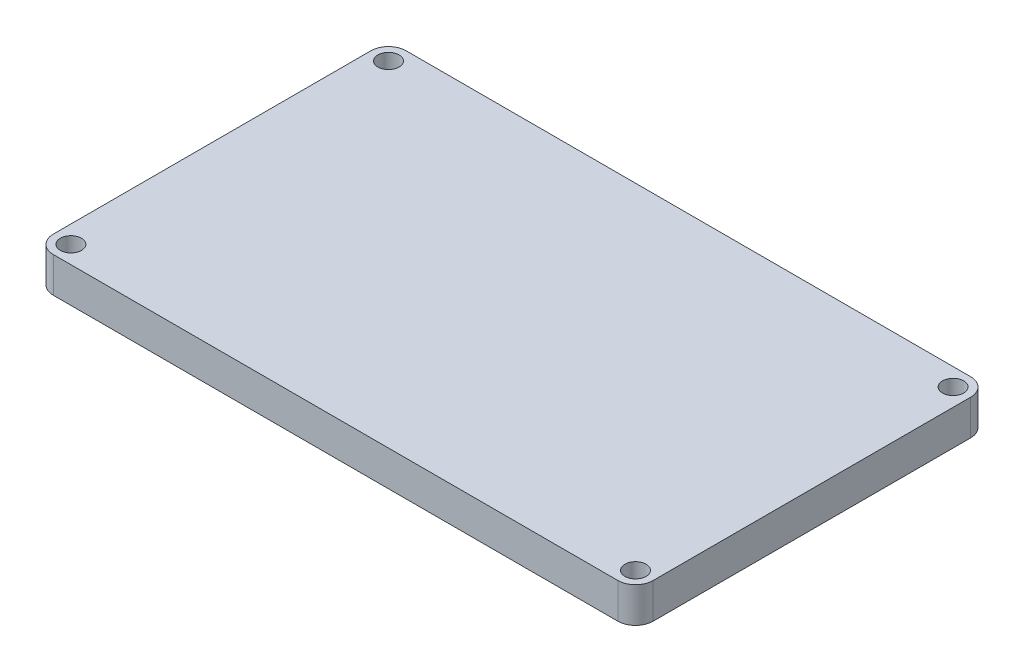
ISO-10303-21;
HEADER;
FILE_DESCRIPTION(('STEP AP214'),'2;1');
FILE_NAME('part.step','',(''),(''),'','','');
FILE_SCHEMA(('AUTOMOTIVE_DESIGN { 1 0 10303 214 1 1 1 1 }'));
ENDSEC;
DATA;
#1=APPLICATION_CONTEXT('core data for automotive mechanical design processes');
#2=APPLICATION_PROTOCOL_DEFINITION('international standard','automotive_design',2000,#1);
#3=PRODUCT_CONTEXT('',#1,'mechanical');
#4=PRODUCT('Part','Part','',(#3));
#5=PRODUCT_RELATED_PRODUCT_CATEGORY('part','',(#4));
#6=PRODUCT_DEFINITION_FORMATION('','',#4);
#7=PRODUCT_DEFINITION_CONTEXT('part definition',#1,'design');
#8=PRODUCT_DEFINITION('design','',#6,#7);
#9=PRODUCT_DEFINITION_SHAPE('','',#8);
#10=(LENGTH_UNIT() NAMED_UNIT(*) SI_UNIT(.MILLI.,.METRE.));
#11=(NAMED_UNIT(*) PLANE_ANGLE_UNIT() SI_UNIT($,.RADIAN.));
#12=(NAMED_UNIT(*) SI_UNIT($,.STERADIAN.) SOLID_ANGLE_UNIT());
#13=UNCERTAINTY_MEASURE_WITH_UNIT(LENGTH_MEASURE(1.E-05),#10,'distance_accuracy_value','');
#14=(GEOMETRIC_REPRESENTATION_CONTEXT(3) GLOBAL_UNCERTAINTY_ASSIGNED_CONTEXT((#13)) GLOBAL_UNIT_ASSIGNED_CONTEXT((#10,
#11,#12)) REPRESENTATION_CONTEXT('',''));
#15=CARTESIAN_POINT('',(0.,0.,0.));
#16=DIRECTION('',(0.,0.,1.));
#17=DIRECTION('',(1.,0.,0.));
#18=AXIS2_PLACEMENT_3D('',#15,#16,#17);
#19=CARTESIAN_POINT('',(-70.6896481169129,10.,0.));
#20=DIRECTION('',(1.,0.,0.));
#21=DIRECTION('',(0.,0.,-1.));
#22=AXIS2_PLACEMENT_3D('',#19,#20,#21);
#23=PLANE('',#22);
#24=DIRECTION('',(0.,0.,1.));
#25=VECTOR('',#24,1.);
#26=CARTESIAN_POINT('',(-70.6896481169129,10.,0.));
#27=LINE('',#26,#25);
#28=CARTESIAN_POINT('',(-70.6896481169129,10.,-35.7852502702385));
#29=VERTEX_POINT('',#28);
#30=CARTESIAN_POINT('',(-70.6896481169129,10.,54.2147497297615));
#31=VERTEX_POINT('',#30);
#32=EDGE_CURVE('E199',#29,#31,#27,.T.);
#33=ORIENTED_EDGE('',*,*,#32,.F.);
#34=DIRECTION('',(0.,-1.,0.));
#35=VECTOR('',#34,1.);
#36=CARTESIAN_POINT('',(-70.6896481169129,0.,-35.7852502702385));
#37=LINE('',#36,#35);
#38=CARTESIAN_POINT('',(-70.6896481169129,0.,-35.7852502702385));
#39=VERTEX_POINT('',#38);
#40=EDGE_CURVE('E11',#29,#39,#37,.T.);
#41=ORIENTED_EDGE('',*,*,#40,.T.);
#42=DIRECTION('',(0.,0.,1.));
#43=VECTOR('',#42,1.);
#44=CARTESIAN_POINT('',(-70.6896481169129,0.,0.));
#45=LINE('',#44,#43);
#46=CARTESIAN_POINT('',(-70.6896481169129,0.,54.2147497297615));
#47=VERTEX_POINT('',#46);
#48=EDGE_CURVE('E137',#39,#47,#45,.T.);
#49=ORIENTED_EDGE('',*,*,#48,.T.);
#50=DIRECTION('',(0.,-1.,0.));
#51=VECTOR('',#50,1.);
#52=CARTESIAN_POINT('',(-70.6896481169129,10.,54.2147497297615));
#53=LINE('',#52,#51);
#54=EDGE_CURVE('E114',#47,#31,#53,.F.);
#55=ORIENTED_EDGE('',*,*,#54,.T.);
#56=EDGE_LOOP('',(#33,#41,#49,#55));
#57=FACE_BOUND('',#56,.T.);
#58=ADVANCED_FACE('F39',(#57),#23,.F.);
#59=CARTESIAN_POINT('',(0.,10.,59.2147497297615));
#60=DIRECTION('',(0.,0.,-1.));
#61=DIRECTION('',(-1.,0.,0.));
#62=AXIS2_PLACEMENT_3D('',#59,#60,#61);
#63=PLANE('',#62);
#64=DIRECTION('',(1.,0.,0.));
#65=VECTOR('',#64,1.);
#66=CARTESIAN_POINT('',(0.,0.,59.2147497297615));
#67=LINE('',#66,#65);
#68=CARTESIAN_POINT('',(-65.6896481169129,0.,59.2147497297615));
#69=VERTEX_POINT('',#68);
#70=CARTESIAN_POINT('',(94.3103518830872,0.,59.2147497297615));
#71=VERTEX_POINT('',#70);
#72=EDGE_CURVE('E124',#69,#71,#67,.T.);
#73=ORIENTED_EDGE('',*,*,#72,.T.);
#74=DIRECTION('',(0.,-1.,0.));
#75=VECTOR('',#74,1.);
#76=CARTESIAN_POINT('',(94.3103518830872,10.,59.2147497297615));
#77=LINE('',#76,#75);
#78=CARTESIAN_POINT('',(94.3103518830872,10.,59.2147497297615));
#79=VERTEX_POINT('',#78);
#80=EDGE_CURVE('E175',#71,#79,#77,.F.);
#81=ORIENTED_EDGE('',*,*,#80,.T.);
#82=DIRECTION('',(1.,0.,0.));
#83=VECTOR('',#82,1.);
#84=CARTESIAN_POINT('',(0.,10.,59.2147497297615));
#85=LINE('',#84,#83);
#86=CARTESIAN_POINT('',(-65.6896481169129,10.,59.2147497297615));
#87=VERTEX_POINT('',#86);
#88=EDGE_CURVE('E127',#87,#79,#85,.T.);
#89=ORIENTED_EDGE('',*,*,#88,.F.);
#90=DIRECTION('',(0.,-1.,0.));
#91=VECTOR('',#90,1.);
#92=CARTESIAN_POINT('',(-65.6896481169129,10.,59.2147497297615));
#93=LINE('',#92,#91);
#94=EDGE_CURVE('E112',#87,#69,#93,.T.);
#95=ORIENTED_EDGE('',*,*,#94,.T.);
#96=EDGE_LOOP('',(#73,#81,#89,#95));
#97=FACE_BOUND('',#96,.T.);
#98=ADVANCED_FACE('F123',(#97),#63,.F.);
#99=CARTESIAN_POINT('',(99.3103518830871,10.,0.));
#100=DIRECTION('',(1.,0.,0.));
#101=DIRECTION('',(0.,0.,-1.));
#102=AXIS2_PLACEMENT_3D('',#99,#100,#101);
#103=PLANE('',#102);
#104=DIRECTION('',(0.,0.,1.));
#105=VECTOR('',#104,1.);
#106=CARTESIAN_POINT('',(99.3103518830871,10.,0.));
#107=LINE('',#106,#105);
#108=CARTESIAN_POINT('',(99.3103518830871,10.,-35.7852502702386));
#109=VERTEX_POINT('',#108);
#110=CARTESIAN_POINT('',(99.3103518830872,10.,54.2147497297615));
#111=VERTEX_POINT('',#110);
#112=EDGE_CURVE('E205',#109,#111,#107,.T.);
#113=ORIENTED_EDGE('',*,*,#112,.T.);
#114=DIRECTION('',(0.,-1.,0.));
#115=VECTOR('',#114,1.);
#116=CARTESIAN_POINT('',(99.3103518830872,0.,54.2147497297615));
#117=LINE('',#116,#115);
#118=CARTESIAN_POINT('',(99.3103518830872,0.,54.2147497297615));
#119=VERTEX_POINT('',#118);
#120=EDGE_CURVE('E163',#111,#119,#117,.T.);
#121=ORIENTED_EDGE('',*,*,#120,.T.);
#122=DIRECTION('',(0.,0.,1.));
#123=VECTOR('',#122,1.);
#124=CARTESIAN_POINT('',(99.3103518830871,0.,0.));
#125=LINE('',#124,#123);
#126=CARTESIAN_POINT('',(99.3103518830871,0.,-35.7852502702386));
#127=VERTEX_POINT('',#126);
#128=EDGE_CURVE('E136',#127,#119,#125,.T.);
#129=ORIENTED_EDGE('',*,*,#128,.F.);
#130=DIRECTION('',(0.,-1.,0.));
#131=VECTOR('',#130,1.);
#132=CARTESIAN_POINT('',(99.3103518830871,10.,-35.7852502702386));
#133=LINE('',#132,#131);
#134=EDGE_CURVE('E160',#127,#109,#133,.F.);
#135=ORIENTED_EDGE('',*,*,#134,.T.);
#136=EDGE_LOOP('',(#113,#121,#129,#135));
#137=FACE_BOUND('',#136,.T.);
#138=ADVANCED_FACE('F253',(#137),#103,.T.);
#139=CARTESIAN_POINT('',(0.,10.,-40.7852502702386));
#140=DIRECTION('',(0.,0.,-1.));
#141=DIRECTION('',(-1.,0.,0.));
#142=AXIS2_PLACEMENT_3D('',#139,#140,#141);
#143=PLANE('',#142);
#144=DIRECTION('',(1.,0.,0.));
#145=VECTOR('',#144,1.);
#146=CARTESIAN_POINT('',(0.,10.,-40.7852502702386));
#147=LINE('',#146,#145);
#148=CARTESIAN_POINT('',(-65.6896481169129,10.,-40.7852502702385));
#149=VERTEX_POINT('',#148);
#150=CARTESIAN_POINT('',(94.3103518830871,10.,-40.7852502702386));
#151=VERTEX_POINT('',#150);
#152=EDGE_CURVE('E191',#149,#151,#147,.T.);
#153=ORIENTED_EDGE('',*,*,#152,.T.);
#154=DIRECTION('',(0.,-1.,0.));
#155=VECTOR('',#154,1.);
#156=CARTESIAN_POINT('',(94.3103518830871,10.,-40.7852502702386));
#157=LINE('',#156,#155);
#158=CARTESIAN_POINT('',(94.3103518830871,0.,-40.7852502702386));
#159=VERTEX_POINT('',#158);
#160=EDGE_CURVE('E48',#151,#159,#157,.T.);
#161=ORIENTED_EDGE('',*,*,#160,.T.);
#162=DIRECTION('',(1.,0.,0.));
#163=VECTOR('',#162,1.);
#164=CARTESIAN_POINT('',(0.,0.,-40.7852502702386));
#165=LINE('',#164,#163);
#166=CARTESIAN_POINT('',(-65.6896481169129,0.,-40.7852502702385));
#167=VERTEX_POINT('',#166);
#168=EDGE_CURVE('E141',#167,#159,#165,.T.);
#169=ORIENTED_EDGE('',*,*,#168,.F.);
#170=DIRECTION('',(0.,-1.,0.));
#171=VECTOR('',#170,1.);
#172=CARTESIAN_POINT('',(-65.6896481169129,10.,-40.7852502702385));
#173=LINE('',#172,#171);
#174=EDGE_CURVE('E62',#167,#149,#173,.F.);
#175=ORIENTED_EDGE('',*,*,#174,.T.);
#176=EDGE_LOOP('',(#153,#161,#169,#175));
#177=FACE_BOUND('',#176,.T.);
#178=ADVANCED_FACE('F190',(#177),#143,.T.);
#179=CARTESIAN_POINT('',(-65.6896481169129,10.,-35.7852502702385));
#180=DIRECTION('',(0.,-1.,0.));
#181=DIRECTION('',(0.,0.,-1.));
#182=AXIS2_PLACEMENT_3D('',#179,#180,#181);
#183=CYLINDRICAL_SURFACE('',#182,3.00000000000001);
#184=CARTESIAN_POINT('',(-65.6896481169129,10.,-35.7852502702385));
#185=DIRECTION('',(0.,1.,0.));
#186=DIRECTION('',(0.,0.,1.));
#187=AXIS2_PLACEMENT_3D('',#184,#185,#186);
#188=CIRCLE('',#187,3.00000000000001);
#189=CARTESIAN_POINT('',(-65.6896481169129,10.,-32.7852502702385));
#190=VERTEX_POINT('',#189);
#191=EDGE_CURVE('E201',#190,#190,#188,.F.);
#192=ORIENTED_EDGE('',*,*,#191,.F.);
#193=EDGE_LOOP('',(#192));
#194=FACE_BOUND('',#193,.T.);
#195=CARTESIAN_POINT('',(-65.6896481169129,0.,-35.7852502702385));
#196=DIRECTION('',(0.,1.,0.));
#197=DIRECTION('',(0.,0.,1.));
#198=AXIS2_PLACEMENT_3D('',#195,#196,#197);
#199=CIRCLE('',#198,3.00000000000001);
#200=CARTESIAN_POINT('',(-65.6896481169129,0.,-32.7852502702385));
#201=VERTEX_POINT('',#200);
#202=EDGE_CURVE('E143',#201,#201,#199,.F.);
#203=ORIENTED_EDGE('',*,*,#202,.T.);
#204=EDGE_LOOP('',(#203));
#205=FACE_BOUND('',#204,.T.);
#206=ADVANCED_FACE('F231',(#194,#205),#183,.F.);
#207=CARTESIAN_POINT('',(94.3103518830872,10.,-35.7852502702386));
#208=DIRECTION('',(0.,-1.,0.));
#209=DIRECTION('',(0.,0.,-1.));
#210=AXIS2_PLACEMENT_3D('',#207,#208,#209);
#211=CYLINDRICAL_SURFACE('',#210,3.00000000000001);
#212=CARTESIAN_POINT('',(94.3103518830872,10.,-35.7852502702386));
#213=DIRECTION('',(0.,1.,0.));
#214=DIRECTION('',(0.,0.,1.));
#215=AXIS2_PLACEMENT_3D('',#212,#213,#214);
#216=CIRCLE('',#215,3.00000000000001);
#217=CARTESIAN_POINT('',(94.3103518830872,10.,-32.7852502702386));
#218=VERTEX_POINT('',#217);
#219=EDGE_CURVE('E208',#218,#218,#216,.T.);
#220=ORIENTED_EDGE('',*,*,#219,.T.);
#221=EDGE_LOOP('',(#220));
#222=FACE_BOUND('',#221,.T.);
#223=CARTESIAN_POINT('',(94.3103518830872,0.,-35.7852502702386));
#224=DIRECTION('',(0.,1.,0.));
#225=DIRECTION('',(0.,0.,1.));
#226=AXIS2_PLACEMENT_3D('',#223,#224,#225);
#227=CIRCLE('',#226,3.00000000000001);
#228=CARTESIAN_POINT('',(94.3103518830872,0.,-32.7852502702386));
#229=VERTEX_POINT('',#228);
#230=EDGE_CURVE('E224',#229,#229,#227,.T.);
#231=ORIENTED_EDGE('',*,*,#230,.F.);
#232=EDGE_LOOP('',(#231));
#233=FACE_BOUND('',#232,.T.);
#234=ADVANCED_FACE('F259',(#222,#233),#211,.F.);
#235=CARTESIAN_POINT('',(-65.6896481169129,10.,54.2147497297615));
#236=DIRECTION('',(0.,-1.,0.));
#237=DIRECTION('',(0.,0.,-1.));
#238=AXIS2_PLACEMENT_3D('',#235,#236,#237);
#239=CYLINDRICAL_SURFACE('',#238,3.00000000000001);
#240=CARTESIAN_POINT('',(-65.6896481169129,10.,54.2147497297615));
#241=DIRECTION('',(0.,1.,0.));
#242=DIRECTION('',(0.,0.,1.));
#243=AXIS2_PLACEMENT_3D('',#240,#241,#242);
#244=CIRCLE('',#243,3.00000000000001);
#245=CARTESIAN_POINT('',(-65.6896481169129,10.,57.2147497297615));
#246=VERTEX_POINT('',#245);
#247=EDGE_CURVE('E153',#246,#246,#244,.T.);
#248=ORIENTED_EDGE('',*,*,#247,.T.);
#249=EDGE_LOOP('',(#248));
#250=FACE_BOUND('',#249,.T.);
#251=CARTESIAN_POINT('',(-65.6896481169129,0.,54.2147497297615));
#252=DIRECTION('',(0.,1.,0.));
#253=DIRECTION('',(0.,0.,1.));
#254=AXIS2_PLACEMENT_3D('',#251,#252,#253);
#255=CIRCLE('',#254,3.00000000000001);
#256=CARTESIAN_POINT('',(-65.6896481169129,0.,57.2147497297615));
#257=VERTEX_POINT('',#256);
#258=EDGE_CURVE('E220',#257,#257,#255,.T.);
#259=ORIENTED_EDGE('',*,*,#258,.F.);
#260=EDGE_LOOP('',(#259));
#261=FACE_BOUND('',#260,.T.);
#262=ADVANCED_FACE('F263',(#250,#261),#239,.F.);
#263=CARTESIAN_POINT('',(94.3103518830872,10.,54.2147497297614));
#264=DIRECTION('',(0.,-1.,0.));
#265=DIRECTION('',(0.,0.,-1.));
#266=AXIS2_PLACEMENT_3D('',#263,#264,#265);
#267=CYLINDRICAL_SURFACE('',#266,3.00000000000001);
#268=CARTESIAN_POINT('',(94.3103518830872,10.,54.2147497297614));
#269=DIRECTION('',(0.,1.,0.));
#270=DIRECTION('',(0.,0.,1.));
#271=AXIS2_PLACEMENT_3D('',#268,#269,#270);
#272=CIRCLE('',#271,3.00000000000001);
#273=CARTESIAN_POINT('',(94.3103518830872,10.,57.2147497297615));
#274=VERTEX_POINT('',#273);
#275=EDGE_CURVE('E129',#274,#274,#272,.F.);
#276=ORIENTED_EDGE('',*,*,#275,.F.);
#277=EDGE_LOOP('',(#276));
#278=FACE_BOUND('',#277,.T.);
#279=CARTESIAN_POINT('',(94.3103518830872,0.,54.2147497297614));
#280=DIRECTION('',(0.,1.,0.));
#281=DIRECTION('',(0.,0.,1.));
#282=AXIS2_PLACEMENT_3D('',#279,#280,#281);
#283=CIRCLE('',#282,3.00000000000001);
#284=CARTESIAN_POINT('',(94.3103518830872,0.,57.2147497297615));
#285=VERTEX_POINT('',#284);
#286=EDGE_CURVE('E150',#285,#285,#283,.F.);
#287=ORIENTED_EDGE('',*,*,#286,.T.);
#288=EDGE_LOOP('',(#287));
#289=FACE_BOUND('',#288,.T.);
#290=ADVANCED_FACE('F243',(#278,#289),#267,.F.);
#291=CARTESIAN_POINT('',(0.,10.,0.));
#292=DIRECTION('',(0.,1.,0.));
#293=DIRECTION('',(0.,0.,1.));
#294=AXIS2_PLACEMENT_3D('',#291,#292,#293);
#295=PLANE('',#294);
#296=ORIENTED_EDGE('',*,*,#247,.F.);
#297=EDGE_LOOP('',(#296));
#298=FACE_BOUND('',#297,.T.);
#299=ORIENTED_EDGE('',*,*,#219,.F.);
#300=EDGE_LOOP('',(#299));
#301=FACE_BOUND('',#300,.T.);
#302=ORIENTED_EDGE('',*,*,#191,.T.);
#303=EDGE_LOOP('',(#302));
#304=FACE_BOUND('',#303,.T.);
#305=ORIENTED_EDGE('',*,*,#88,.T.);
#306=CARTESIAN_POINT('',(94.3103518830872,10.,54.2147497297615));
#307=DIRECTION('',(0.,1.,0.));
#308=DIRECTION('',(0.,0.,1.));
#309=AXIS2_PLACEMENT_3D('',#306,#307,#308);
#310=CIRCLE('',#309,5.);
#311=EDGE_CURVE('E183',#79,#111,#310,.T.);
#312=ORIENTED_EDGE('',*,*,#311,.T.);
#313=ORIENTED_EDGE('',*,*,#112,.F.);
#314=CARTESIAN_POINT('',(94.3103518830871,10.,-35.7852502702386));
#315=DIRECTION('',(0.,1.,0.));
#316=DIRECTION('',(0.,0.,1.));
#317=AXIS2_PLACEMENT_3D('',#314,#315,#316);
#318=CIRCLE('',#317,5.);
#319=EDGE_CURVE('E55',#109,#151,#318,.T.);
#320=ORIENTED_EDGE('',*,*,#319,.T.);
#321=ORIENTED_EDGE('',*,*,#152,.F.);
#322=CARTESIAN_POINT('',(-65.6896481169129,10.,-35.7852502702385));
#323=DIRECTION('',(0.,1.,0.));
#324=DIRECTION('',(0.,0.,1.));
#325=AXIS2_PLACEMENT_3D('',#322,#323,#324);
#326=CIRCLE('',#325,5.);
#327=EDGE_CURVE('E178',#149,#29,#326,.T.);
#328=ORIENTED_EDGE('',*,*,#327,.T.);
#329=ORIENTED_EDGE('',*,*,#32,.T.);
#330=CARTESIAN_POINT('',(-65.6896481169129,10.,54.2147497297615));
#331=DIRECTION('',(0.,1.,0.));
#332=DIRECTION('',(0.,0.,1.));
#333=AXIS2_PLACEMENT_3D('',#330,#331,#332);
#334=CIRCLE('',#333,5.);
#335=EDGE_CURVE('E157',#31,#87,#334,.T.);
#336=ORIENTED_EDGE('',*,*,#335,.T.);
#337=EDGE_LOOP('',(#305,#312,#313,#320,#321,#328,#329,#336));
#338=FACE_BOUND('',#337,.T.);
#339=ORIENTED_EDGE('',*,*,#275,.T.);
#340=EDGE_LOOP('',(#339));
#341=FACE_BOUND('',#340,.T.);
#342=ADVANCED_FACE('F234',(#298,#301,#304,#338,#341),#295,.T.);
#343=CARTESIAN_POINT('',(0.,0.,0.));
#344=DIRECTION('',(0.,1.,0.));
#345=DIRECTION('',(0.,0.,1.));
#346=AXIS2_PLACEMENT_3D('',#343,#344,#345);
#347=PLANE('',#346);
#348=ORIENTED_EDGE('',*,*,#258,.T.);
#349=EDGE_LOOP('',(#348));
#350=FACE_BOUND('',#349,.T.);
#351=ORIENTED_EDGE('',*,*,#230,.T.);
#352=EDGE_LOOP('',(#351));
#353=FACE_BOUND('',#352,.T.);
#354=ORIENTED_EDGE('',*,*,#202,.F.);
#355=EDGE_LOOP('',(#354));
#356=FACE_BOUND('',#355,.T.);
#357=ORIENTED_EDGE('',*,*,#128,.T.);
#358=CARTESIAN_POINT('',(94.3103518830872,0.,54.2147497297615));
#359=DIRECTION('',(0.,1.,0.));
#360=DIRECTION('',(0.,0.,1.));
#361=AXIS2_PLACEMENT_3D('',#358,#359,#360);
#362=CIRCLE('',#361,5.);
#363=EDGE_CURVE('E134',#119,#71,#362,.F.);
#364=ORIENTED_EDGE('',*,*,#363,.T.);
#365=ORIENTED_EDGE('',*,*,#72,.F.);
#366=CARTESIAN_POINT('',(-65.6896481169129,0.,54.2147497297615));
#367=DIRECTION('',(0.,1.,0.));
#368=DIRECTION('',(0.,0.,1.));
#369=AXIS2_PLACEMENT_3D('',#366,#367,#368);
#370=CIRCLE('',#369,5.);
#371=EDGE_CURVE('E108',#69,#47,#370,.F.);
#372=ORIENTED_EDGE('',*,*,#371,.T.);
#373=ORIENTED_EDGE('',*,*,#48,.F.);
#374=CARTESIAN_POINT('',(-65.6896481169129,0.,-35.7852502702385));
#375=DIRECTION('',(0.,1.,0.));
#376=DIRECTION('',(0.,0.,1.));
#377=AXIS2_PLACEMENT_3D('',#374,#375,#376);
#378=CIRCLE('',#377,5.);
#379=EDGE_CURVE('E167',#39,#167,#378,.F.);
#380=ORIENTED_EDGE('',*,*,#379,.T.);
#381=ORIENTED_EDGE('',*,*,#168,.T.);
#382=CARTESIAN_POINT('',(94.3103518830871,0.,-35.7852502702386));
#383=DIRECTION('',(0.,1.,0.));
#384=DIRECTION('',(0.,0.,1.));
#385=AXIS2_PLACEMENT_3D('',#382,#383,#384);
#386=CIRCLE('',#385,5.);
#387=EDGE_CURVE('E170',#159,#127,#386,.F.);
#388=ORIENTED_EDGE('',*,*,#387,.T.);
#389=EDGE_LOOP('',(#357,#364,#365,#372,#373,#380,#381,#388));
#390=FACE_BOUND('',#389,.T.);
#391=ORIENTED_EDGE('',*,*,#286,.F.);
#392=EDGE_LOOP('',(#391));
#393=FACE_BOUND('',#392,.T.);
#394=ADVANCED_FACE('F132',(#350,#353,#356,#390,#393),#347,.F.);
#395=CARTESIAN_POINT('',(-65.6896481169129,10.,54.2147497297615));
#396=DIRECTION('',(0.,-1.,0.));
#397=DIRECTION('',(0.,0.,-1.));
#398=AXIS2_PLACEMENT_3D('',#395,#396,#397);
#399=CYLINDRICAL_SURFACE('',#398,5.);
#400=ORIENTED_EDGE('',*,*,#335,.F.);
#401=ORIENTED_EDGE('',*,*,#54,.F.);
#402=ORIENTED_EDGE('',*,*,#371,.F.);
#403=ORIENTED_EDGE('',*,*,#94,.F.);
#404=EDGE_LOOP('',(#400,#401,#402,#403));
#405=FACE_BOUND('',#404,.T.);
#406=ADVANCED_FACE('F111',(#405),#399,.T.);
#407=CARTESIAN_POINT('',(94.3103518830872,10.,54.2147497297615));
#408=DIRECTION('',(0.,1.,0.));
#409=DIRECTION('',(0.,0.,1.));
#410=AXIS2_PLACEMENT_3D('',#407,#408,#409);
#411=CYLINDRICAL_SURFACE('',#410,5.);
#412=ORIENTED_EDGE('',*,*,#311,.F.);
#413=ORIENTED_EDGE('',*,*,#80,.F.);
#414=ORIENTED_EDGE('',*,*,#363,.F.);
#415=ORIENTED_EDGE('',*,*,#120,.F.);
#416=EDGE_LOOP('',(#412,#413,#414,#415));
#417=FACE_BOUND('',#416,.T.);
#418=ADVANCED_FACE('F241',(#417),#411,.T.);
#419=CARTESIAN_POINT('',(94.3103518830871,10.,-35.7852502702386));
#420=DIRECTION('',(0.,-1.,0.));
#421=DIRECTION('',(0.,0.,-1.));
#422=AXIS2_PLACEMENT_3D('',#419,#420,#421);
#423=CYLINDRICAL_SURFACE('',#422,5.);
#424=ORIENTED_EDGE('',*,*,#319,.F.);
#425=ORIENTED_EDGE('',*,*,#134,.F.);
#426=ORIENTED_EDGE('',*,*,#387,.F.);
#427=ORIENTED_EDGE('',*,*,#160,.F.);
#428=EDGE_LOOP('',(#424,#425,#426,#427));
#429=FACE_BOUND('',#428,.T.);
#430=ADVANCED_FACE('F269',(#429),#423,.T.);
#431=CARTESIAN_POINT('',(-65.6896481169129,10.,-35.7852502702385));
#432=DIRECTION('',(0.,1.,0.));
#433=DIRECTION('',(0.,0.,1.));
#434=AXIS2_PLACEMENT_3D('',#431,#432,#433);
#435=CYLINDRICAL_SURFACE('',#434,5.);
#436=ORIENTED_EDGE('',*,*,#327,.F.);
#437=ORIENTED_EDGE('',*,*,#174,.F.);
#438=ORIENTED_EDGE('',*,*,#379,.F.);
#439=ORIENTED_EDGE('',*,*,#40,.F.);
#440=EDGE_LOOP('',(#436,#437,#438,#439));
#441=FACE_BOUND('',#440,.T.);
#442=ADVANCED_FACE('F41',(#441),#435,.T.);
#443=CLOSED_SHELL('',(#58,#98,#138,#178,#206,#234,#262,#290,#342,#394,#406,#418,#430,#442));
#444=MANIFOLD_SOLID_BREP('B2',#443);
#445=ADVANCED_BREP_SHAPE_REPRESENTATION('',(#18,#444),#14);
#446=SHAPE_DEFINITION_REPRESENTATION(#9,#445);
ENDSEC;
END-ISO-10303-21;
